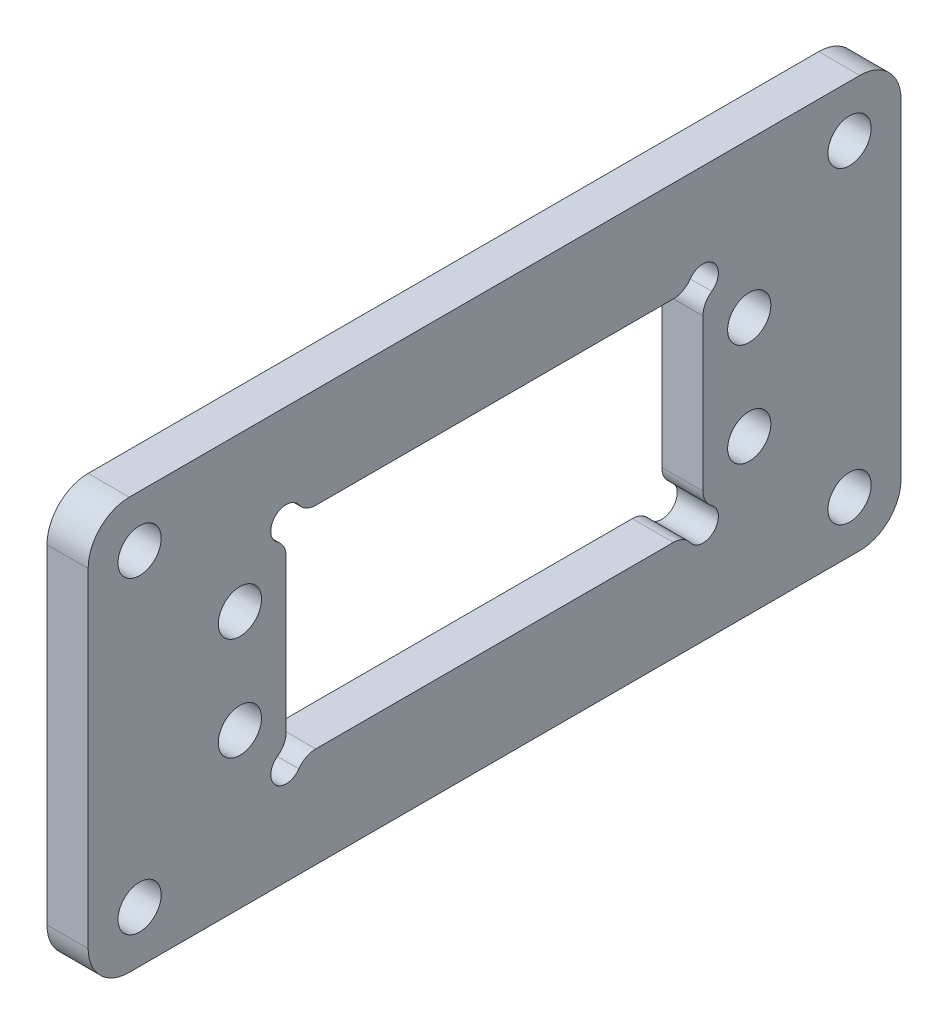
ISO-10303-21;
HEADER;
FILE_DESCRIPTION(('STEP AP214'),'2;1');
FILE_NAME('part.step','',(''),(''),'','','');
FILE_SCHEMA(('AUTOMOTIVE_DESIGN { 1 0 10303 214 1 1 1 1 }'));
ENDSEC;
DATA;
#1=APPLICATION_CONTEXT('core data for automotive mechanical design processes');
#2=APPLICATION_PROTOCOL_DEFINITION('international standard','automotive_design',2000,#1);
#3=PRODUCT_CONTEXT('',#1,'mechanical');
#4=PRODUCT('Part','Part','',(#3));
#5=PRODUCT_RELATED_PRODUCT_CATEGORY('part','',(#4));
#6=PRODUCT_DEFINITION_FORMATION('','',#4);
#7=PRODUCT_DEFINITION_CONTEXT('part definition',#1,'design');
#8=PRODUCT_DEFINITION('design','',#6,#7);
#9=PRODUCT_DEFINITION_SHAPE('','',#8);
#10=(LENGTH_UNIT() NAMED_UNIT(*) SI_UNIT(.MILLI.,.METRE.));
#11=(NAMED_UNIT(*) PLANE_ANGLE_UNIT() SI_UNIT($,.RADIAN.));
#12=(NAMED_UNIT(*) SI_UNIT($,.STERADIAN.) SOLID_ANGLE_UNIT());
#13=UNCERTAINTY_MEASURE_WITH_UNIT(LENGTH_MEASURE(1.E-05),#10,'distance_accuracy_value','');
#14=(GEOMETRIC_REPRESENTATION_CONTEXT(3) GLOBAL_UNCERTAINTY_ASSIGNED_CONTEXT((#13)) GLOBAL_UNIT_ASSIGNED_CONTEXT((#10,
#11,#12)) REPRESENTATION_CONTEXT('',''));
#15=CARTESIAN_POINT('',(0.,0.,0.));
#16=DIRECTION('',(0.,0.,1.));
#17=DIRECTION('',(1.,0.,0.));
#18=AXIS2_PLACEMENT_3D('',#15,#16,#17);
#19=CARTESIAN_POINT('',(4.,0.,0.));
#20=DIRECTION('',(-1.,0.,0.));
#21=DIRECTION('',(0.,0.,1.));
#22=AXIS2_PLACEMENT_3D('',#19,#20,#21);
#23=PLANE('',#22);
#24=DIRECTION('',(0.,0.,-1.));
#25=VECTOR('',#24,1.);
#26=CARTESIAN_POINT('',(4.,-20.,39.5));
#27=LINE('',#26,#25);
#28=CARTESIAN_POINT('',(4.,-20.,35.5));
#29=VERTEX_POINT('',#28);
#30=CARTESIAN_POINT('',(4.,-20.,-35.5));
#31=VERTEX_POINT('',#30);
#32=EDGE_CURVE('E246',#29,#31,#27,.T.);
#33=ORIENTED_EDGE('',*,*,#32,.T.);
#34=CARTESIAN_POINT('',(4.,-16.,-35.5));
#35=DIRECTION('',(-1.,0.,0.));
#36=DIRECTION('',(0.,0.,1.));
#37=AXIS2_PLACEMENT_3D('',#34,#35,#36);
#38=CIRCLE('',#37,4.);
#39=CARTESIAN_POINT('',(4.,-16.,-39.5));
#40=VERTEX_POINT('',#39);
#41=EDGE_CURVE('E266',#31,#40,#38,.F.);
#42=ORIENTED_EDGE('',*,*,#41,.T.);
#43=DIRECTION('',(0.,1.,0.));
#44=VECTOR('',#43,1.);
#45=CARTESIAN_POINT('',(4.,-20.,-39.5));
#46=LINE('',#45,#44);
#47=CARTESIAN_POINT('',(4.,16.,-39.5));
#48=VERTEX_POINT('',#47);
#49=EDGE_CURVE('E228',#40,#48,#46,.T.);
#50=ORIENTED_EDGE('',*,*,#49,.T.);
#51=CARTESIAN_POINT('',(4.,16.,-35.5));
#52=DIRECTION('',(-1.,0.,0.));
#53=DIRECTION('',(0.,0.,1.));
#54=AXIS2_PLACEMENT_3D('',#51,#52,#53);
#55=CIRCLE('',#54,4.);
#56=CARTESIAN_POINT('',(4.,20.,-35.5));
#57=VERTEX_POINT('',#56);
#58=EDGE_CURVE('E262',#48,#57,#55,.F.);
#59=ORIENTED_EDGE('',*,*,#58,.T.);
#60=DIRECTION('',(0.,0.,1.));
#61=VECTOR('',#60,1.);
#62=CARTESIAN_POINT('',(4.,20.,39.5));
#63=LINE('',#62,#61);
#64=CARTESIAN_POINT('',(4.,20.,35.5));
#65=VERTEX_POINT('',#64);
#66=EDGE_CURVE('E453',#57,#65,#63,.T.);
#67=ORIENTED_EDGE('',*,*,#66,.T.);
#68=CARTESIAN_POINT('',(4.,16.,35.5));
#69=DIRECTION('',(-1.,0.,0.));
#70=DIRECTION('',(0.,0.,1.));
#71=AXIS2_PLACEMENT_3D('',#68,#69,#70);
#72=CIRCLE('',#71,4.);
#73=CARTESIAN_POINT('',(4.,16.,39.5));
#74=VERTEX_POINT('',#73);
#75=EDGE_CURVE('E260',#65,#74,#72,.F.);
#76=ORIENTED_EDGE('',*,*,#75,.T.);
#77=DIRECTION('',(0.,-1.,0.));
#78=VECTOR('',#77,1.);
#79=CARTESIAN_POINT('',(4.,-20.,39.5));
#80=LINE('',#79,#78);
#81=CARTESIAN_POINT('',(4.,-16.,39.5));
#82=VERTEX_POINT('',#81);
#83=EDGE_CURVE('E455',#74,#82,#80,.T.);
#84=ORIENTED_EDGE('',*,*,#83,.T.);
#85=CARTESIAN_POINT('',(4.,-16.,35.5));
#86=DIRECTION('',(-1.,0.,0.));
#87=DIRECTION('',(0.,0.,1.));
#88=AXIS2_PLACEMENT_3D('',#85,#86,#87);
#89=CIRCLE('',#88,4.);
#90=EDGE_CURVE('E264',#82,#29,#89,.F.);
#91=ORIENTED_EDGE('',*,*,#90,.T.);
#92=EDGE_LOOP('',(#33,#42,#50,#59,#67,#76,#84,#91));
#93=FACE_BOUND('',#92,.T.);
#94=CARTESIAN_POINT('',(4.,10.25,-20.25));
#95=DIRECTION('',(1.,0.,0.));
#96=DIRECTION('',(0.,0.,-1.));
#97=AXIS2_PLACEMENT_3D('',#94,#95,#96);
#98=CIRCLE('',#97,1.5);
#99=CARTESIAN_POINT('',(4.,9.01902229002756,-21.1071428571428));
#100=VERTEX_POINT('',#99);
#101=CARTESIAN_POINT('',(4.,11.1071428571429,-19.0190222900275));
#102=VERTEX_POINT('',#101);
#103=EDGE_CURVE('E381',#100,#102,#98,.T.);
#104=ORIENTED_EDGE('',*,*,#103,.F.);
#105=CARTESIAN_POINT('',(4.,7.37771867673098,-22.25));
#106=DIRECTION('',(-1.,0.,0.));
#107=DIRECTION('',(0.,0.,1.));
#108=AXIS2_PLACEMENT_3D('',#105,#106,#107);
#109=CIRCLE('',#108,2.);
#110=CARTESIAN_POINT('',(4.,7.37771867673098,-20.25));
#111=VERTEX_POINT('',#110);
#112=EDGE_CURVE('E298',#100,#111,#109,.F.);
#113=ORIENTED_EDGE('',*,*,#112,.T.);
#114=DIRECTION('',(0.,1.,0.));
#115=VECTOR('',#114,1.);
#116=CARTESIAN_POINT('',(4.,-10.25,-20.25));
#117=LINE('',#116,#115);
#118=CARTESIAN_POINT('',(4.,-7.36674537458786,-20.25));
#119=VERTEX_POINT('',#118);
#120=EDGE_CURVE('E243',#119,#111,#117,.T.);
#121=ORIENTED_EDGE('',*,*,#120,.F.);
#122=CARTESIAN_POINT('',(4.,-7.36674537458786,-22.25));
#123=DIRECTION('',(-1.,0.,0.));
#124=DIRECTION('',(0.,0.,1.));
#125=AXIS2_PLACEMENT_3D('',#122,#123,#124);
#126=CIRCLE('',#125,2.);
#127=CARTESIAN_POINT('',(4.,-9.00804898788443,-21.1071428571428));
#128=VERTEX_POINT('',#127);
#129=EDGE_CURVE('E296',#119,#128,#126,.F.);
#130=ORIENTED_EDGE('',*,*,#129,.T.);
#131=CARTESIAN_POINT('',(4.,-10.2390266978569,-20.25));
#132=DIRECTION('',(1.,0.,0.));
#133=DIRECTION('',(0.,0.,-1.));
#134=AXIS2_PLACEMENT_3D('',#131,#132,#133);
#135=CIRCLE('',#134,1.5);
#136=CARTESIAN_POINT('',(4.,-11.1008723987754,-19.022310304756));
#137=VERTEX_POINT('',#136);
#138=EDGE_CURVE('E378',#137,#128,#135,.T.);
#139=ORIENTED_EDGE('',*,*,#138,.F.);
#140=CARTESIAN_POINT('',(4.,-12.25,-17.3853907110973));
#141=DIRECTION('',(-1.,0.,0.));
#142=DIRECTION('',(0.,0.,1.));
#143=AXIS2_PLACEMENT_3D('',#140,#141,#142);
#144=CIRCLE('',#143,2.);
#145=CARTESIAN_POINT('',(4.,-10.25,-17.3853907110973));
#146=VERTEX_POINT('',#145);
#147=EDGE_CURVE('E294',#137,#146,#144,.F.);
#148=ORIENTED_EDGE('',*,*,#147,.T.);
#149=DIRECTION('',(0.,0.,-1.));
#150=VECTOR('',#149,1.);
#151=CARTESIAN_POINT('',(4.,-10.25,-20.25));
#152=LINE('',#151,#150);
#153=CARTESIAN_POINT('',(4.,-10.25,17.377718676731));
#154=VERTEX_POINT('',#153);
#155=EDGE_CURVE('E442',#154,#146,#152,.T.);
#156=ORIENTED_EDGE('',*,*,#155,.F.);
#157=CARTESIAN_POINT('',(4.,-12.25,17.377718676731));
#158=DIRECTION('',(-1.,0.,0.));
#159=DIRECTION('',(0.,0.,1.));
#160=AXIS2_PLACEMENT_3D('',#157,#158,#159);
#161=CIRCLE('',#160,2.);
#162=CARTESIAN_POINT('',(4.,-11.1071428571429,19.0190222900276));
#163=VERTEX_POINT('',#162);
#164=EDGE_CURVE('E292',#154,#163,#161,.F.);
#165=ORIENTED_EDGE('',*,*,#164,.T.);
#166=CARTESIAN_POINT('',(4.,-10.25,20.25));
#167=DIRECTION('',(1.,0.,0.));
#168=DIRECTION('',(0.,0.,-1.));
#169=AXIS2_PLACEMENT_3D('',#166,#167,#168);
#170=CIRCLE('',#169,1.5);
#171=CARTESIAN_POINT('',(4.,-9.01902229002758,21.1071428571429));
#172=VERTEX_POINT('',#171);
#173=EDGE_CURVE('E373',#172,#163,#170,.T.);
#174=ORIENTED_EDGE('',*,*,#173,.F.);
#175=CARTESIAN_POINT('',(4.,-7.377718676731,22.25));
#176=DIRECTION('',(-1.,0.,0.));
#177=DIRECTION('',(0.,0.,1.));
#178=AXIS2_PLACEMENT_3D('',#175,#176,#177);
#179=CIRCLE('',#178,2.);
#180=CARTESIAN_POINT('',(4.,-7.377718676731,20.25));
#181=VERTEX_POINT('',#180);
#182=EDGE_CURVE('E290',#172,#181,#179,.F.);
#183=ORIENTED_EDGE('',*,*,#182,.T.);
#184=DIRECTION('',(0.,-1.,0.));
#185=VECTOR('',#184,1.);
#186=CARTESIAN_POINT('',(4.,-10.25,20.25));
#187=LINE('',#186,#185);
#188=CARTESIAN_POINT('',(4.,7.37771867673098,20.25));
#189=VERTEX_POINT('',#188);
#190=EDGE_CURVE('E357',#189,#181,#187,.T.);
#191=ORIENTED_EDGE('',*,*,#190,.F.);
#192=CARTESIAN_POINT('',(4.,7.37771867673098,22.25));
#193=DIRECTION('',(-1.,0.,0.));
#194=DIRECTION('',(0.,0.,1.));
#195=AXIS2_PLACEMENT_3D('',#192,#193,#194);
#196=CIRCLE('',#195,2.);
#197=CARTESIAN_POINT('',(4.,9.01902229002756,21.1071428571429));
#198=VERTEX_POINT('',#197);
#199=EDGE_CURVE('E288',#189,#198,#196,.F.);
#200=ORIENTED_EDGE('',*,*,#199,.T.);
#201=CARTESIAN_POINT('',(4.,10.25,20.25));
#202=DIRECTION('',(1.,0.,0.));
#203=DIRECTION('',(0.,0.,-1.));
#204=AXIS2_PLACEMENT_3D('',#201,#202,#203);
#205=CIRCLE('',#204,1.5);
#206=CARTESIAN_POINT('',(4.,11.1071428571428,19.0190222900276));
#207=VERTEX_POINT('',#206);
#208=EDGE_CURVE('E365',#207,#198,#205,.T.);
#209=ORIENTED_EDGE('',*,*,#208,.F.);
#210=CARTESIAN_POINT('',(4.,12.25,17.377718676731));
#211=DIRECTION('',(-1.,0.,0.));
#212=DIRECTION('',(0.,0.,1.));
#213=AXIS2_PLACEMENT_3D('',#210,#211,#212);
#214=CIRCLE('',#213,2.);
#215=CARTESIAN_POINT('',(4.,10.25,17.377718676731));
#216=VERTEX_POINT('',#215);
#217=EDGE_CURVE('E284',#207,#216,#214,.F.);
#218=ORIENTED_EDGE('',*,*,#217,.T.);
#219=DIRECTION('',(0.,0.,1.));
#220=VECTOR('',#219,1.);
#221=CARTESIAN_POINT('',(4.,10.25,-20.25));
#222=LINE('',#221,#220);
#223=CARTESIAN_POINT('',(4.,10.25,-17.377718676731));
#224=VERTEX_POINT('',#223);
#225=EDGE_CURVE('E237',#224,#216,#222,.T.);
#226=ORIENTED_EDGE('',*,*,#225,.F.);
#227=CARTESIAN_POINT('',(4.,12.25,-17.377718676731));
#228=DIRECTION('',(-1.,0.,0.));
#229=DIRECTION('',(0.,0.,1.));
#230=AXIS2_PLACEMENT_3D('',#227,#228,#229);
#231=CIRCLE('',#230,2.);
#232=EDGE_CURVE('E286',#224,#102,#231,.F.);
#233=ORIENTED_EDGE('',*,*,#232,.T.);
#234=EDGE_LOOP('',(#104,#113,#121,#130,#139,#148,#156,#165,#174,#183,#191,#200,#209,#218,#226,#233));
#235=FACE_BOUND('',#234,.T.);
#236=CARTESIAN_POINT('',(4.,15.,34.5));
#237=DIRECTION('',(1.,0.,0.));
#238=DIRECTION('',(0.,0.,-1.));
#239=AXIS2_PLACEMENT_3D('',#236,#237,#238);
#240=CIRCLE('',#239,2.1);
#241=CARTESIAN_POINT('',(4.,15.,32.4));
#242=VERTEX_POINT('',#241);
#243=EDGE_CURVE('E434',#242,#242,#240,.T.);
#244=ORIENTED_EDGE('',*,*,#243,.F.);
#245=EDGE_LOOP('',(#244));
#246=FACE_BOUND('',#245,.T.);
#247=CARTESIAN_POINT('',(4.,-15.,34.5));
#248=DIRECTION('',(1.,0.,0.));
#249=DIRECTION('',(0.,0.,-1.));
#250=AXIS2_PLACEMENT_3D('',#247,#248,#249);
#251=CIRCLE('',#250,2.1);
#252=CARTESIAN_POINT('',(4.,-15.,32.4));
#253=VERTEX_POINT('',#252);
#254=EDGE_CURVE('E428',#253,#253,#251,.T.);
#255=ORIENTED_EDGE('',*,*,#254,.F.);
#256=EDGE_LOOP('',(#255));
#257=FACE_BOUND('',#256,.T.);
#258=CARTESIAN_POINT('',(4.,-5.00000000000001,24.75));
#259=DIRECTION('',(1.,0.,0.));
#260=DIRECTION('',(0.,0.,-1.));
#261=AXIS2_PLACEMENT_3D('',#258,#259,#260);
#262=CIRCLE('',#261,2.1);
#263=CARTESIAN_POINT('',(4.,-5.00000000000001,22.65));
#264=VERTEX_POINT('',#263);
#265=EDGE_CURVE('E422',#264,#264,#262,.T.);
#266=ORIENTED_EDGE('',*,*,#265,.F.);
#267=EDGE_LOOP('',(#266));
#268=FACE_BOUND('',#267,.T.);
#269=CARTESIAN_POINT('',(4.,4.99999999999999,24.75));
#270=DIRECTION('',(1.,0.,0.));
#271=DIRECTION('',(0.,0.,-1.));
#272=AXIS2_PLACEMENT_3D('',#269,#270,#271);
#273=CIRCLE('',#272,2.1);
#274=CARTESIAN_POINT('',(4.,4.99999999999999,22.65));
#275=VERTEX_POINT('',#274);
#276=EDGE_CURVE('E416',#275,#275,#273,.T.);
#277=ORIENTED_EDGE('',*,*,#276,.F.);
#278=EDGE_LOOP('',(#277));
#279=FACE_BOUND('',#278,.T.);
#280=CARTESIAN_POINT('',(4.,4.99999999999999,-24.75));
#281=DIRECTION('',(1.,0.,0.));
#282=DIRECTION('',(0.,0.,-1.));
#283=AXIS2_PLACEMENT_3D('',#280,#281,#282);
#284=CIRCLE('',#283,2.1);
#285=CARTESIAN_POINT('',(4.,4.99999999999999,-26.85));
#286=VERTEX_POINT('',#285);
#287=EDGE_CURVE('E410',#286,#286,#284,.T.);
#288=ORIENTED_EDGE('',*,*,#287,.F.);
#289=EDGE_LOOP('',(#288));
#290=FACE_BOUND('',#289,.T.);
#291=CARTESIAN_POINT('',(4.,-5.00000000000001,-24.75));
#292=DIRECTION('',(1.,0.,0.));
#293=DIRECTION('',(0.,0.,-1.));
#294=AXIS2_PLACEMENT_3D('',#291,#292,#293);
#295=CIRCLE('',#294,2.1);
#296=CARTESIAN_POINT('',(4.,-5.00000000000001,-26.85));
#297=VERTEX_POINT('',#296);
#298=EDGE_CURVE('E404',#297,#297,#295,.T.);
#299=ORIENTED_EDGE('',*,*,#298,.F.);
#300=EDGE_LOOP('',(#299));
#301=FACE_BOUND('',#300,.T.);
#302=CARTESIAN_POINT('',(4.,15.,-34.5));
#303=DIRECTION('',(1.,0.,0.));
#304=DIRECTION('',(0.,0.,-1.));
#305=AXIS2_PLACEMENT_3D('',#302,#303,#304);
#306=CIRCLE('',#305,2.1);
#307=CARTESIAN_POINT('',(4.,15.,-36.6));
#308=VERTEX_POINT('',#307);
#309=EDGE_CURVE('E398',#308,#308,#306,.T.);
#310=ORIENTED_EDGE('',*,*,#309,.F.);
#311=EDGE_LOOP('',(#310));
#312=FACE_BOUND('',#311,.T.);
#313=CARTESIAN_POINT('',(4.,-15.,-34.5));
#314=DIRECTION('',(1.,0.,0.));
#315=DIRECTION('',(0.,0.,-1.));
#316=AXIS2_PLACEMENT_3D('',#313,#314,#315);
#317=CIRCLE('',#316,2.1);
#318=CARTESIAN_POINT('',(4.,-15.,-36.6));
#319=VERTEX_POINT('',#318);
#320=EDGE_CURVE('E392',#319,#319,#317,.T.);
#321=ORIENTED_EDGE('',*,*,#320,.F.);
#322=EDGE_LOOP('',(#321));
#323=FACE_BOUND('',#322,.T.);
#324=ADVANCED_FACE('F45',(#93,#235,#246,#257,#268,#279,#290,#301,#312,#323),#23,.F.);
#325=CARTESIAN_POINT('',(0.,0.,0.));
#326=DIRECTION('',(-1.,0.,0.));
#327=DIRECTION('',(0.,0.,1.));
#328=AXIS2_PLACEMENT_3D('',#325,#326,#327);
#329=PLANE('',#328);
#330=DIRECTION('',(0.,1.,0.));
#331=VECTOR('',#330,1.);
#332=CARTESIAN_POINT('',(0.,-10.25,-20.25));
#333=LINE('',#332,#331);
#334=CARTESIAN_POINT('',(0.,-7.36674537458786,-20.25));
#335=VERTEX_POINT('',#334);
#336=CARTESIAN_POINT('',(0.,7.37771867673098,-20.25));
#337=VERTEX_POINT('',#336);
#338=EDGE_CURVE('E358',#335,#337,#333,.T.);
#339=ORIENTED_EDGE('',*,*,#338,.T.);
#340=CARTESIAN_POINT('',(0.,7.37771867673098,-22.25));
#341=DIRECTION('',(-1.,0.,0.));
#342=DIRECTION('',(0.,0.,1.));
#343=AXIS2_PLACEMENT_3D('',#340,#341,#342);
#344=CIRCLE('',#343,2.);
#345=CARTESIAN_POINT('',(0.,9.01902229002756,-21.1071428571428));
#346=VERTEX_POINT('',#345);
#347=EDGE_CURVE('E316',#337,#346,#344,.T.);
#348=ORIENTED_EDGE('',*,*,#347,.T.);
#349=CARTESIAN_POINT('',(0.,10.25,-20.25));
#350=DIRECTION('',(-1.,0.,0.));
#351=DIRECTION('',(0.,0.,1.));
#352=AXIS2_PLACEMENT_3D('',#349,#350,#351);
#353=CIRCLE('',#352,1.5);
#354=CARTESIAN_POINT('',(0.,11.1071428571429,-19.0190222900275));
#355=VERTEX_POINT('',#354);
#356=EDGE_CURVE('E375',#355,#346,#353,.T.);
#357=ORIENTED_EDGE('',*,*,#356,.F.);
#358=CARTESIAN_POINT('',(0.,12.25,-17.377718676731));
#359=DIRECTION('',(-1.,0.,0.));
#360=DIRECTION('',(0.,0.,1.));
#361=AXIS2_PLACEMENT_3D('',#358,#359,#360);
#362=CIRCLE('',#361,2.);
#363=CARTESIAN_POINT('',(0.,10.25,-17.377718676731));
#364=VERTEX_POINT('',#363);
#365=EDGE_CURVE('E306',#355,#364,#362,.T.);
#366=ORIENTED_EDGE('',*,*,#365,.T.);
#367=DIRECTION('',(0.,0.,1.));
#368=VECTOR('',#367,1.);
#369=CARTESIAN_POINT('',(0.,10.25,-20.25));
#370=LINE('',#369,#368);
#371=CARTESIAN_POINT('',(0.,10.25,17.377718676731));
#372=VERTEX_POINT('',#371);
#373=EDGE_CURVE('E347',#364,#372,#370,.T.);
#374=ORIENTED_EDGE('',*,*,#373,.T.);
#375=CARTESIAN_POINT('',(0.,12.25,17.377718676731));
#376=DIRECTION('',(-1.,0.,0.));
#377=DIRECTION('',(0.,0.,1.));
#378=AXIS2_PLACEMENT_3D('',#375,#376,#377);
#379=CIRCLE('',#378,2.);
#380=CARTESIAN_POINT('',(0.,11.1071428571428,19.0190222900276));
#381=VERTEX_POINT('',#380);
#382=EDGE_CURVE('E304',#372,#381,#379,.T.);
#383=ORIENTED_EDGE('',*,*,#382,.T.);
#384=CARTESIAN_POINT('',(0.,10.25,20.25));
#385=DIRECTION('',(-1.,0.,0.));
#386=DIRECTION('',(0.,0.,1.));
#387=AXIS2_PLACEMENT_3D('',#384,#385,#386);
#388=CIRCLE('',#387,1.5);
#389=CARTESIAN_POINT('',(0.,9.01902229002756,21.1071428571429));
#390=VERTEX_POINT('',#389);
#391=EDGE_CURVE('E367',#390,#381,#388,.T.);
#392=ORIENTED_EDGE('',*,*,#391,.F.);
#393=CARTESIAN_POINT('',(0.,7.37771867673098,22.25));
#394=DIRECTION('',(-1.,0.,0.));
#395=DIRECTION('',(0.,0.,1.));
#396=AXIS2_PLACEMENT_3D('',#393,#394,#395);
#397=CIRCLE('',#396,2.);
#398=CARTESIAN_POINT('',(0.,7.37771867673098,20.25));
#399=VERTEX_POINT('',#398);
#400=EDGE_CURVE('E308',#390,#399,#397,.T.);
#401=ORIENTED_EDGE('',*,*,#400,.T.);
#402=DIRECTION('',(0.,-1.,0.));
#403=VECTOR('',#402,1.);
#404=CARTESIAN_POINT('',(0.,-10.25,20.25));
#405=LINE('',#404,#403);
#406=CARTESIAN_POINT('',(0.,-7.377718676731,20.25));
#407=VERTEX_POINT('',#406);
#408=EDGE_CURVE('E437',#399,#407,#405,.T.);
#409=ORIENTED_EDGE('',*,*,#408,.T.);
#410=CARTESIAN_POINT('',(0.,-7.377718676731,22.25));
#411=DIRECTION('',(-1.,0.,0.));
#412=DIRECTION('',(0.,0.,1.));
#413=AXIS2_PLACEMENT_3D('',#410,#411,#412);
#414=CIRCLE('',#413,2.);
#415=CARTESIAN_POINT('',(0.,-9.01902229002758,21.1071428571429));
#416=VERTEX_POINT('',#415);
#417=EDGE_CURVE('E310',#407,#416,#414,.T.);
#418=ORIENTED_EDGE('',*,*,#417,.T.);
#419=CARTESIAN_POINT('',(0.,-10.25,20.25));
#420=DIRECTION('',(-1.,0.,0.));
#421=DIRECTION('',(0.,0.,1.));
#422=AXIS2_PLACEMENT_3D('',#419,#420,#421);
#423=CIRCLE('',#422,1.5);
#424=CARTESIAN_POINT('',(0.,-11.1071428571429,19.0190222900276));
#425=VERTEX_POINT('',#424);
#426=EDGE_CURVE('E388',#425,#416,#423,.T.);
#427=ORIENTED_EDGE('',*,*,#426,.F.);
#428=CARTESIAN_POINT('',(0.,-12.25,17.377718676731));
#429=DIRECTION('',(-1.,0.,0.));
#430=DIRECTION('',(0.,0.,1.));
#431=AXIS2_PLACEMENT_3D('',#428,#429,#430);
#432=CIRCLE('',#431,2.);
#433=CARTESIAN_POINT('',(0.,-10.25,17.377718676731));
#434=VERTEX_POINT('',#433);
#435=EDGE_CURVE('E312',#425,#434,#432,.T.);
#436=ORIENTED_EDGE('',*,*,#435,.T.);
#437=DIRECTION('',(0.,0.,-1.));
#438=VECTOR('',#437,1.);
#439=CARTESIAN_POINT('',(0.,-10.25,-20.25));
#440=LINE('',#439,#438);
#441=CARTESIAN_POINT('',(0.,-10.25,-17.3853907110973));
#442=VERTEX_POINT('',#441);
#443=EDGE_CURVE('E449',#434,#442,#440,.T.);
#444=ORIENTED_EDGE('',*,*,#443,.T.);
#445=CARTESIAN_POINT('',(0.,-12.25,-17.3853907110973));
#446=DIRECTION('',(-1.,0.,0.));
#447=DIRECTION('',(0.,0.,1.));
#448=AXIS2_PLACEMENT_3D('',#445,#446,#447);
#449=CIRCLE('',#448,2.);
#450=CARTESIAN_POINT('',(0.,-11.1008723987754,-19.022310304756));
#451=VERTEX_POINT('',#450);
#452=EDGE_CURVE('E60',#442,#451,#449,.T.);
#453=ORIENTED_EDGE('',*,*,#452,.T.);
#454=CARTESIAN_POINT('',(0.,-10.2390266978569,-20.25));
#455=DIRECTION('',(-1.,0.,0.));
#456=DIRECTION('',(0.,0.,1.));
#457=AXIS2_PLACEMENT_3D('',#454,#455,#456);
#458=CIRCLE('',#457,1.5);
#459=CARTESIAN_POINT('',(0.,-9.00804898788443,-21.1071428571428));
#460=VERTEX_POINT('',#459);
#461=EDGE_CURVE('E386',#460,#451,#458,.T.);
#462=ORIENTED_EDGE('',*,*,#461,.F.);
#463=CARTESIAN_POINT('',(0.,-7.36674537458786,-22.25));
#464=DIRECTION('',(-1.,0.,0.));
#465=DIRECTION('',(0.,0.,1.));
#466=AXIS2_PLACEMENT_3D('',#463,#464,#465);
#467=CIRCLE('',#466,2.);
#468=EDGE_CURVE('E68',#460,#335,#467,.T.);
#469=ORIENTED_EDGE('',*,*,#468,.T.);
#470=EDGE_LOOP('',(#339,#348,#357,#366,#374,#383,#392,#401,#409,#418,#427,#436,#444,#453,#462,#469));
#471=FACE_BOUND('',#470,.T.);
#472=CARTESIAN_POINT('',(0.,15.,-34.5));
#473=DIRECTION('',(1.,0.,0.));
#474=DIRECTION('',(0.,0.,-1.));
#475=AXIS2_PLACEMENT_3D('',#472,#473,#474);
#476=CIRCLE('',#475,2.1);
#477=CARTESIAN_POINT('',(0.,15.,-36.6));
#478=VERTEX_POINT('',#477);
#479=EDGE_CURVE('E395',#478,#478,#476,.T.);
#480=ORIENTED_EDGE('',*,*,#479,.T.);
#481=EDGE_LOOP('',(#480));
#482=FACE_BOUND('',#481,.T.);
#483=CARTESIAN_POINT('',(0.,4.99999999999999,-24.75));
#484=DIRECTION('',(1.,0.,0.));
#485=DIRECTION('',(0.,0.,-1.));
#486=AXIS2_PLACEMENT_3D('',#483,#484,#485);
#487=CIRCLE('',#486,2.1);
#488=CARTESIAN_POINT('',(0.,4.99999999999999,-26.85));
#489=VERTEX_POINT('',#488);
#490=EDGE_CURVE('E407',#489,#489,#487,.T.);
#491=ORIENTED_EDGE('',*,*,#490,.T.);
#492=EDGE_LOOP('',(#491));
#493=FACE_BOUND('',#492,.T.);
#494=CARTESIAN_POINT('',(0.,-5.00000000000001,24.75));
#495=DIRECTION('',(1.,0.,0.));
#496=DIRECTION('',(0.,0.,-1.));
#497=AXIS2_PLACEMENT_3D('',#494,#495,#496);
#498=CIRCLE('',#497,2.1);
#499=CARTESIAN_POINT('',(0.,-5.00000000000001,22.65));
#500=VERTEX_POINT('',#499);
#501=EDGE_CURVE('E419',#500,#500,#498,.T.);
#502=ORIENTED_EDGE('',*,*,#501,.T.);
#503=EDGE_LOOP('',(#502));
#504=FACE_BOUND('',#503,.T.);
#505=CARTESIAN_POINT('',(0.,15.,34.5));
#506=DIRECTION('',(1.,0.,0.));
#507=DIRECTION('',(0.,0.,-1.));
#508=AXIS2_PLACEMENT_3D('',#505,#506,#507);
#509=CIRCLE('',#508,2.1);
#510=CARTESIAN_POINT('',(0.,15.,32.4));
#511=VERTEX_POINT('',#510);
#512=EDGE_CURVE('E431',#511,#511,#509,.T.);
#513=ORIENTED_EDGE('',*,*,#512,.T.);
#514=EDGE_LOOP('',(#513));
#515=FACE_BOUND('',#514,.T.);
#516=DIRECTION('',(0.,1.,0.));
#517=VECTOR('',#516,1.);
#518=CARTESIAN_POINT('',(0.,-20.,-39.5));
#519=LINE('',#518,#517);
#520=CARTESIAN_POINT('',(0.,-16.,-39.5));
#521=VERTEX_POINT('',#520);
#522=CARTESIAN_POINT('',(0.,16.,-39.5));
#523=VERTEX_POINT('',#522);
#524=EDGE_CURVE('E225',#521,#523,#519,.T.);
#525=ORIENTED_EDGE('',*,*,#524,.F.);
#526=CARTESIAN_POINT('',(0.,-16.,-35.5));
#527=DIRECTION('',(-1.,0.,0.));
#528=DIRECTION('',(0.,0.,1.));
#529=AXIS2_PLACEMENT_3D('',#526,#527,#528);
#530=CIRCLE('',#529,4.);
#531=CARTESIAN_POINT('',(0.,-20.,-35.5));
#532=VERTEX_POINT('',#531);
#533=EDGE_CURVE('E208',#521,#532,#530,.T.);
#534=ORIENTED_EDGE('',*,*,#533,.T.);
#535=DIRECTION('',(0.,0.,-1.));
#536=VECTOR('',#535,1.);
#537=CARTESIAN_POINT('',(0.,-20.,39.5));
#538=LINE('',#537,#536);
#539=CARTESIAN_POINT('',(0.,-20.,35.5));
#540=VERTEX_POINT('',#539);
#541=EDGE_CURVE('E251',#540,#532,#538,.T.);
#542=ORIENTED_EDGE('',*,*,#541,.F.);
#543=CARTESIAN_POINT('',(0.,-16.,35.5));
#544=DIRECTION('',(-1.,0.,0.));
#545=DIRECTION('',(0.,0.,1.));
#546=AXIS2_PLACEMENT_3D('',#543,#544,#545);
#547=CIRCLE('',#546,4.);
#548=CARTESIAN_POINT('',(0.,-16.,39.5));
#549=VERTEX_POINT('',#548);
#550=EDGE_CURVE('E219',#540,#549,#547,.T.);
#551=ORIENTED_EDGE('',*,*,#550,.T.);
#552=DIRECTION('',(0.,-1.,0.));
#553=VECTOR('',#552,1.);
#554=CARTESIAN_POINT('',(0.,-20.,39.5));
#555=LINE('',#554,#553);
#556=CARTESIAN_POINT('',(0.,16.,39.5));
#557=VERTEX_POINT('',#556);
#558=EDGE_CURVE('E240',#557,#549,#555,.T.);
#559=ORIENTED_EDGE('',*,*,#558,.F.);
#560=CARTESIAN_POINT('',(0.,16.,35.5));
#561=DIRECTION('',(-1.,0.,0.));
#562=DIRECTION('',(0.,0.,1.));
#563=AXIS2_PLACEMENT_3D('',#560,#561,#562);
#564=CIRCLE('',#563,4.);
#565=CARTESIAN_POINT('',(0.,20.,35.5));
#566=VERTEX_POINT('',#565);
#567=EDGE_CURVE('E229',#557,#566,#564,.T.);
#568=ORIENTED_EDGE('',*,*,#567,.T.);
#569=DIRECTION('',(0.,0.,1.));
#570=VECTOR('',#569,1.);
#571=CARTESIAN_POINT('',(0.,20.,39.5));
#572=LINE('',#571,#570);
#573=CARTESIAN_POINT('',(0.,20.,-35.5));
#574=VERTEX_POINT('',#573);
#575=EDGE_CURVE('E236',#574,#566,#572,.T.);
#576=ORIENTED_EDGE('',*,*,#575,.F.);
#577=CARTESIAN_POINT('',(0.,16.,-35.5));
#578=DIRECTION('',(-1.,0.,0.));
#579=DIRECTION('',(0.,0.,1.));
#580=AXIS2_PLACEMENT_3D('',#577,#578,#579);
#581=CIRCLE('',#580,4.);
#582=EDGE_CURVE('E235',#574,#523,#581,.T.);
#583=ORIENTED_EDGE('',*,*,#582,.T.);
#584=EDGE_LOOP('',(#525,#534,#542,#551,#559,#568,#576,#583));
#585=FACE_BOUND('',#584,.T.);
#586=CARTESIAN_POINT('',(0.,-15.,34.5));
#587=DIRECTION('',(1.,0.,0.));
#588=DIRECTION('',(0.,0.,-1.));
#589=AXIS2_PLACEMENT_3D('',#586,#587,#588);
#590=CIRCLE('',#589,2.1);
#591=CARTESIAN_POINT('',(0.,-15.,32.4));
#592=VERTEX_POINT('',#591);
#593=EDGE_CURVE('E425',#592,#592,#590,.T.);
#594=ORIENTED_EDGE('',*,*,#593,.T.);
#595=EDGE_LOOP('',(#594));
#596=FACE_BOUND('',#595,.T.);
#597=CARTESIAN_POINT('',(0.,4.99999999999999,24.75));
#598=DIRECTION('',(1.,0.,0.));
#599=DIRECTION('',(0.,0.,-1.));
#600=AXIS2_PLACEMENT_3D('',#597,#598,#599);
#601=CIRCLE('',#600,2.1);
#602=CARTESIAN_POINT('',(0.,4.99999999999999,22.65));
#603=VERTEX_POINT('',#602);
#604=EDGE_CURVE('E413',#603,#603,#601,.T.);
#605=ORIENTED_EDGE('',*,*,#604,.T.);
#606=EDGE_LOOP('',(#605));
#607=FACE_BOUND('',#606,.T.);
#608=CARTESIAN_POINT('',(0.,-5.00000000000001,-24.75));
#609=DIRECTION('',(1.,0.,0.));
#610=DIRECTION('',(0.,0.,-1.));
#611=AXIS2_PLACEMENT_3D('',#608,#609,#610);
#612=CIRCLE('',#611,2.1);
#613=CARTESIAN_POINT('',(0.,-5.00000000000001,-26.85));
#614=VERTEX_POINT('',#613);
#615=EDGE_CURVE('E401',#614,#614,#612,.T.);
#616=ORIENTED_EDGE('',*,*,#615,.T.);
#617=EDGE_LOOP('',(#616));
#618=FACE_BOUND('',#617,.T.);
#619=CARTESIAN_POINT('',(0.,-15.,-34.5));
#620=DIRECTION('',(1.,0.,0.));
#621=DIRECTION('',(0.,0.,-1.));
#622=AXIS2_PLACEMENT_3D('',#619,#620,#621);
#623=CIRCLE('',#622,2.1);
#624=CARTESIAN_POINT('',(0.,-15.,-36.6));
#625=VERTEX_POINT('',#624);
#626=EDGE_CURVE('E391',#625,#625,#623,.T.);
#627=ORIENTED_EDGE('',*,*,#626,.T.);
#628=EDGE_LOOP('',(#627));
#629=FACE_BOUND('',#628,.T.);
#630=ADVANCED_FACE('F232',(#471,#482,#493,#504,#515,#585,#596,#607,#618,#629),#329,.T.);
#631=CARTESIAN_POINT('',(4.,-20.,-39.5));
#632=DIRECTION('',(0.,0.,1.));
#633=DIRECTION('',(1.,0.,0.));
#634=AXIS2_PLACEMENT_3D('',#631,#632,#633);
#635=PLANE('',#634);
#636=ORIENTED_EDGE('',*,*,#49,.F.);
#637=DIRECTION('',(-1.,0.,0.));
#638=VECTOR('',#637,1.);
#639=CARTESIAN_POINT('',(4.,-16.,-39.5));
#640=LINE('',#639,#638);
#641=EDGE_CURVE('E212',#40,#521,#640,.T.);
#642=ORIENTED_EDGE('',*,*,#641,.T.);
#643=ORIENTED_EDGE('',*,*,#524,.T.);
#644=DIRECTION('',(-1.,0.,0.));
#645=VECTOR('',#644,1.);
#646=CARTESIAN_POINT('',(4.,16.,-39.5));
#647=LINE('',#646,#645);
#648=EDGE_CURVE('E230',#523,#48,#647,.F.);
#649=ORIENTED_EDGE('',*,*,#648,.T.);
#650=EDGE_LOOP('',(#636,#642,#643,#649));
#651=FACE_BOUND('',#650,.T.);
#652=ADVANCED_FACE('F224',(#651),#635,.F.);
#653=CARTESIAN_POINT('',(4.,20.,39.5));
#654=DIRECTION('',(0.,-1.,0.));
#655=DIRECTION('',(0.,0.,-1.));
#656=AXIS2_PLACEMENT_3D('',#653,#654,#655);
#657=PLANE('',#656);
#658=ORIENTED_EDGE('',*,*,#66,.F.);
#659=DIRECTION('',(-1.,0.,0.));
#660=VECTOR('',#659,1.);
#661=CARTESIAN_POINT('',(4.,20.,-35.5));
#662=LINE('',#661,#660);
#663=EDGE_CURVE('E275',#57,#574,#662,.T.);
#664=ORIENTED_EDGE('',*,*,#663,.T.);
#665=ORIENTED_EDGE('',*,*,#575,.T.);
#666=DIRECTION('',(-1.,0.,0.));
#667=VECTOR('',#666,1.);
#668=CARTESIAN_POINT('',(4.,20.,35.5));
#669=LINE('',#668,#667);
#670=EDGE_CURVE('E273',#566,#65,#669,.F.);
#671=ORIENTED_EDGE('',*,*,#670,.T.);
#672=EDGE_LOOP('',(#658,#664,#665,#671));
#673=FACE_BOUND('',#672,.T.);
#674=ADVANCED_FACE('F478',(#673),#657,.F.);
#675=CARTESIAN_POINT('',(4.,-20.,39.5));
#676=DIRECTION('',(0.,0.,-1.));
#677=DIRECTION('',(-1.,0.,0.));
#678=AXIS2_PLACEMENT_3D('',#675,#676,#677);
#679=PLANE('',#678);
#680=ORIENTED_EDGE('',*,*,#558,.T.);
#681=DIRECTION('',(-1.,0.,0.));
#682=VECTOR('',#681,1.);
#683=CARTESIAN_POINT('',(4.,-16.,39.5));
#684=LINE('',#683,#682);
#685=EDGE_CURVE('E271',#549,#82,#684,.F.);
#686=ORIENTED_EDGE('',*,*,#685,.T.);
#687=ORIENTED_EDGE('',*,*,#83,.F.);
#688=DIRECTION('',(-1.,0.,0.));
#689=VECTOR('',#688,1.);
#690=CARTESIAN_POINT('',(4.,16.,39.5));
#691=LINE('',#690,#689);
#692=EDGE_CURVE('E268',#74,#557,#691,.T.);
#693=ORIENTED_EDGE('',*,*,#692,.T.);
#694=EDGE_LOOP('',(#680,#686,#687,#693));
#695=FACE_BOUND('',#694,.T.);
#696=ADVANCED_FACE('F470',(#695),#679,.F.);
#697=CARTESIAN_POINT('',(4.,-20.,39.5));
#698=DIRECTION('',(0.,1.,0.));
#699=DIRECTION('',(0.,0.,1.));
#700=AXIS2_PLACEMENT_3D('',#697,#698,#699);
#701=PLANE('',#700);
#702=ORIENTED_EDGE('',*,*,#541,.T.);
#703=DIRECTION('',(-1.,0.,0.));
#704=VECTOR('',#703,1.);
#705=CARTESIAN_POINT('',(4.,-20.,-35.5));
#706=LINE('',#705,#704);
#707=EDGE_CURVE('E213',#532,#31,#706,.F.);
#708=ORIENTED_EDGE('',*,*,#707,.T.);
#709=ORIENTED_EDGE('',*,*,#32,.F.);
#710=DIRECTION('',(-1.,0.,0.));
#711=VECTOR('',#710,1.);
#712=CARTESIAN_POINT('',(4.,-20.,35.5));
#713=LINE('',#712,#711);
#714=EDGE_CURVE('E218',#29,#540,#713,.T.);
#715=ORIENTED_EDGE('',*,*,#714,.T.);
#716=EDGE_LOOP('',(#702,#708,#709,#715));
#717=FACE_BOUND('',#716,.T.);
#718=ADVANCED_FACE('F464',(#717),#701,.F.);
#719=CARTESIAN_POINT('',(4.,-10.25,20.25));
#720=DIRECTION('',(0.,0.,-1.));
#721=DIRECTION('',(-1.,0.,0.));
#722=AXIS2_PLACEMENT_3D('',#719,#720,#721);
#723=PLANE('',#722);
#724=ORIENTED_EDGE('',*,*,#190,.T.);
#725=DIRECTION('',(-1.,0.,0.));
#726=VECTOR('',#725,1.);
#727=CARTESIAN_POINT('',(0.,-7.377718676731,20.25));
#728=LINE('',#727,#726);
#729=EDGE_CURVE('E335',#181,#407,#728,.T.);
#730=ORIENTED_EDGE('',*,*,#729,.T.);
#731=ORIENTED_EDGE('',*,*,#408,.F.);
#732=DIRECTION('',(-1.,0.,0.));
#733=VECTOR('',#732,1.);
#734=CARTESIAN_POINT('',(4.,7.37771867673098,20.25));
#735=LINE('',#734,#733);
#736=EDGE_CURVE('E333',#399,#189,#735,.F.);
#737=ORIENTED_EDGE('',*,*,#736,.T.);
#738=EDGE_LOOP('',(#724,#730,#731,#737));
#739=FACE_BOUND('',#738,.T.);
#740=ADVANCED_FACE('F498',(#739),#723,.T.);
#741=CARTESIAN_POINT('',(4.,-10.25,-20.25));
#742=DIRECTION('',(0.,1.,0.));
#743=DIRECTION('',(0.,0.,1.));
#744=AXIS2_PLACEMENT_3D('',#741,#742,#743);
#745=PLANE('',#744);
#746=ORIENTED_EDGE('',*,*,#155,.T.);
#747=DIRECTION('',(-1.,0.,0.));
#748=VECTOR('',#747,1.);
#749=CARTESIAN_POINT('',(0.,-10.25,-17.3853907110973));
#750=LINE('',#749,#748);
#751=EDGE_CURVE('E325',#146,#442,#750,.T.);
#752=ORIENTED_EDGE('',*,*,#751,.T.);
#753=ORIENTED_EDGE('',*,*,#443,.F.);
#754=DIRECTION('',(-1.,0.,0.));
#755=VECTOR('',#754,1.);
#756=CARTESIAN_POINT('',(4.,-10.25,17.377718676731));
#757=LINE('',#756,#755);
#758=EDGE_CURVE('E323',#434,#154,#757,.F.);
#759=ORIENTED_EDGE('',*,*,#758,.T.);
#760=EDGE_LOOP('',(#746,#752,#753,#759));
#761=FACE_BOUND('',#760,.T.);
#762=ADVANCED_FACE('F554',(#761),#745,.T.);
#763=CARTESIAN_POINT('',(4.,-10.25,-20.25));
#764=DIRECTION('',(0.,0.,1.));
#765=DIRECTION('',(1.,0.,0.));
#766=AXIS2_PLACEMENT_3D('',#763,#764,#765);
#767=PLANE('',#766);
#768=ORIENTED_EDGE('',*,*,#120,.T.);
#769=DIRECTION('',(-1.,0.,0.));
#770=VECTOR('',#769,1.);
#771=CARTESIAN_POINT('',(0.,7.37771867673098,-20.25));
#772=LINE('',#771,#770);
#773=EDGE_CURVE('E302',#111,#337,#772,.T.);
#774=ORIENTED_EDGE('',*,*,#773,.T.);
#775=ORIENTED_EDGE('',*,*,#338,.F.);
#776=DIRECTION('',(-1.,0.,0.));
#777=VECTOR('',#776,1.);
#778=CARTESIAN_POINT('',(4.,-7.36674537458786,-20.25));
#779=LINE('',#778,#777);
#780=EDGE_CURVE('E300',#335,#119,#779,.F.);
#781=ORIENTED_EDGE('',*,*,#780,.T.);
#782=EDGE_LOOP('',(#768,#774,#775,#781));
#783=FACE_BOUND('',#782,.T.);
#784=ADVANCED_FACE('F552',(#783),#767,.T.);
#785=CARTESIAN_POINT('',(4.,10.25,-20.25));
#786=DIRECTION('',(0.,-1.,0.));
#787=DIRECTION('',(0.,0.,-1.));
#788=AXIS2_PLACEMENT_3D('',#785,#786,#787);
#789=PLANE('',#788);
#790=ORIENTED_EDGE('',*,*,#373,.F.);
#791=DIRECTION('',(-1.,0.,0.));
#792=VECTOR('',#791,1.);
#793=CARTESIAN_POINT('',(4.,10.25,-17.377718676731));
#794=LINE('',#793,#792);
#795=EDGE_CURVE('E11',#364,#224,#794,.F.);
#796=ORIENTED_EDGE('',*,*,#795,.T.);
#797=ORIENTED_EDGE('',*,*,#225,.T.);
#798=DIRECTION('',(-1.,0.,0.));
#799=VECTOR('',#798,1.);
#800=CARTESIAN_POINT('',(0.,10.25,17.377718676731));
#801=LINE('',#800,#799);
#802=EDGE_CURVE('E53',#216,#372,#801,.T.);
#803=ORIENTED_EDGE('',*,*,#802,.T.);
#804=EDGE_LOOP('',(#790,#796,#797,#803));
#805=FACE_BOUND('',#804,.T.);
#806=ADVANCED_FACE('F346',(#805),#789,.T.);
#807=CARTESIAN_POINT('',(4.,15.,34.5));
#808=DIRECTION('',(-1.,0.,0.));
#809=DIRECTION('',(0.,0.,1.));
#810=AXIS2_PLACEMENT_3D('',#807,#808,#809);
#811=CYLINDRICAL_SURFACE('',#810,2.1);
#812=ORIENTED_EDGE('',*,*,#243,.T.);
#813=EDGE_LOOP('',(#812));
#814=FACE_BOUND('',#813,.T.);
#815=ORIENTED_EDGE('',*,*,#512,.F.);
#816=EDGE_LOOP('',(#815));
#817=FACE_BOUND('',#816,.T.);
#818=ADVANCED_FACE('F545',(#814,#817),#811,.F.);
#819=CARTESIAN_POINT('',(4.,-15.,34.5));
#820=DIRECTION('',(-1.,0.,0.));
#821=DIRECTION('',(0.,0.,1.));
#822=AXIS2_PLACEMENT_3D('',#819,#820,#821);
#823=CYLINDRICAL_SURFACE('',#822,2.1);
#824=ORIENTED_EDGE('',*,*,#254,.T.);
#825=EDGE_LOOP('',(#824));
#826=FACE_BOUND('',#825,.T.);
#827=ORIENTED_EDGE('',*,*,#593,.F.);
#828=EDGE_LOOP('',(#827));
#829=FACE_BOUND('',#828,.T.);
#830=ADVANCED_FACE('F541',(#826,#829),#823,.F.);
#831=CARTESIAN_POINT('',(4.,-5.00000000000001,24.75));
#832=DIRECTION('',(-1.,0.,0.));
#833=DIRECTION('',(0.,0.,1.));
#834=AXIS2_PLACEMENT_3D('',#831,#832,#833);
#835=CYLINDRICAL_SURFACE('',#834,2.1);
#836=ORIENTED_EDGE('',*,*,#265,.T.);
#837=EDGE_LOOP('',(#836));
#838=FACE_BOUND('',#837,.T.);
#839=ORIENTED_EDGE('',*,*,#501,.F.);
#840=EDGE_LOOP('',(#839));
#841=FACE_BOUND('',#840,.T.);
#842=ADVANCED_FACE('F537',(#838,#841),#835,.F.);
#843=CARTESIAN_POINT('',(4.,4.99999999999999,24.75));
#844=DIRECTION('',(-1.,0.,0.));
#845=DIRECTION('',(0.,0.,1.));
#846=AXIS2_PLACEMENT_3D('',#843,#844,#845);
#847=CYLINDRICAL_SURFACE('',#846,2.1);
#848=ORIENTED_EDGE('',*,*,#276,.T.);
#849=EDGE_LOOP('',(#848));
#850=FACE_BOUND('',#849,.T.);
#851=ORIENTED_EDGE('',*,*,#604,.F.);
#852=EDGE_LOOP('',(#851));
#853=FACE_BOUND('',#852,.T.);
#854=ADVANCED_FACE('F533',(#850,#853),#847,.F.);
#855=CARTESIAN_POINT('',(4.,4.99999999999999,-24.75));
#856=DIRECTION('',(-1.,0.,0.));
#857=DIRECTION('',(0.,0.,1.));
#858=AXIS2_PLACEMENT_3D('',#855,#856,#857);
#859=CYLINDRICAL_SURFACE('',#858,2.1);
#860=ORIENTED_EDGE('',*,*,#287,.T.);
#861=EDGE_LOOP('',(#860));
#862=FACE_BOUND('',#861,.T.);
#863=ORIENTED_EDGE('',*,*,#490,.F.);
#864=EDGE_LOOP('',(#863));
#865=FACE_BOUND('',#864,.T.);
#866=ADVANCED_FACE('F529',(#862,#865),#859,.F.);
#867=CARTESIAN_POINT('',(4.,-5.00000000000001,-24.75));
#868=DIRECTION('',(-1.,0.,0.));
#869=DIRECTION('',(0.,0.,1.));
#870=AXIS2_PLACEMENT_3D('',#867,#868,#869);
#871=CYLINDRICAL_SURFACE('',#870,2.1);
#872=ORIENTED_EDGE('',*,*,#298,.T.);
#873=EDGE_LOOP('',(#872));
#874=FACE_BOUND('',#873,.T.);
#875=ORIENTED_EDGE('',*,*,#615,.F.);
#876=EDGE_LOOP('',(#875));
#877=FACE_BOUND('',#876,.T.);
#878=ADVANCED_FACE('F520',(#874,#877),#871,.F.);
#879=CARTESIAN_POINT('',(4.,15.,-34.5));
#880=DIRECTION('',(-1.,0.,0.));
#881=DIRECTION('',(0.,0.,1.));
#882=AXIS2_PLACEMENT_3D('',#879,#880,#881);
#883=CYLINDRICAL_SURFACE('',#882,2.1);
#884=ORIENTED_EDGE('',*,*,#309,.T.);
#885=EDGE_LOOP('',(#884));
#886=FACE_BOUND('',#885,.T.);
#887=ORIENTED_EDGE('',*,*,#479,.F.);
#888=EDGE_LOOP('',(#887));
#889=FACE_BOUND('',#888,.T.);
#890=ADVANCED_FACE('F514',(#886,#889),#883,.F.);
#891=CARTESIAN_POINT('',(4.,-15.,-34.5));
#892=DIRECTION('',(-1.,0.,0.));
#893=DIRECTION('',(0.,0.,1.));
#894=AXIS2_PLACEMENT_3D('',#891,#892,#893);
#895=CYLINDRICAL_SURFACE('',#894,2.1);
#896=ORIENTED_EDGE('',*,*,#320,.T.);
#897=EDGE_LOOP('',(#896));
#898=FACE_BOUND('',#897,.T.);
#899=ORIENTED_EDGE('',*,*,#626,.F.);
#900=EDGE_LOOP('',(#899));
#901=FACE_BOUND('',#900,.T.);
#902=ADVANCED_FACE('F510',(#898,#901),#895,.F.);
#903=CARTESIAN_POINT('',(4.,-16.,-35.5));
#904=DIRECTION('',(-1.,0.,0.));
#905=DIRECTION('',(0.,0.,1.));
#906=AXIS2_PLACEMENT_3D('',#903,#904,#905);
#907=CYLINDRICAL_SURFACE('',#906,4.);
#908=ORIENTED_EDGE('',*,*,#41,.F.);
#909=ORIENTED_EDGE('',*,*,#707,.F.);
#910=ORIENTED_EDGE('',*,*,#533,.F.);
#911=ORIENTED_EDGE('',*,*,#641,.F.);
#912=EDGE_LOOP('',(#908,#909,#910,#911));
#913=FACE_BOUND('',#912,.T.);
#914=ADVANCED_FACE('F211',(#913),#907,.T.);
#915=CARTESIAN_POINT('',(4.,-16.,35.5));
#916=DIRECTION('',(-1.,0.,0.));
#917=DIRECTION('',(0.,0.,1.));
#918=AXIS2_PLACEMENT_3D('',#915,#916,#917);
#919=CYLINDRICAL_SURFACE('',#918,4.);
#920=ORIENTED_EDGE('',*,*,#90,.F.);
#921=ORIENTED_EDGE('',*,*,#685,.F.);
#922=ORIENTED_EDGE('',*,*,#550,.F.);
#923=ORIENTED_EDGE('',*,*,#714,.F.);
#924=EDGE_LOOP('',(#920,#921,#922,#923));
#925=FACE_BOUND('',#924,.T.);
#926=ADVANCED_FACE('F466',(#925),#919,.T.);
#927=CARTESIAN_POINT('',(4.,16.,-35.5));
#928=DIRECTION('',(-1.,0.,0.));
#929=DIRECTION('',(0.,0.,1.));
#930=AXIS2_PLACEMENT_3D('',#927,#928,#929);
#931=CYLINDRICAL_SURFACE('',#930,4.);
#932=ORIENTED_EDGE('',*,*,#58,.F.);
#933=ORIENTED_EDGE('',*,*,#648,.F.);
#934=ORIENTED_EDGE('',*,*,#582,.F.);
#935=ORIENTED_EDGE('',*,*,#663,.F.);
#936=EDGE_LOOP('',(#932,#933,#934,#935));
#937=FACE_BOUND('',#936,.T.);
#938=ADVANCED_FACE('F482',(#937),#931,.T.);
#939=CARTESIAN_POINT('',(4.,16.,35.5));
#940=DIRECTION('',(-1.,0.,0.));
#941=DIRECTION('',(0.,0.,1.));
#942=AXIS2_PLACEMENT_3D('',#939,#940,#941);
#943=CYLINDRICAL_SURFACE('',#942,4.);
#944=ORIENTED_EDGE('',*,*,#75,.F.);
#945=ORIENTED_EDGE('',*,*,#670,.F.);
#946=ORIENTED_EDGE('',*,*,#567,.F.);
#947=ORIENTED_EDGE('',*,*,#692,.F.);
#948=EDGE_LOOP('',(#944,#945,#946,#947));
#949=FACE_BOUND('',#948,.T.);
#950=ADVANCED_FACE('F474',(#949),#943,.T.);
#951=CARTESIAN_POINT('',(-6.,10.25,20.25));
#952=DIRECTION('',(1.,0.,0.));
#953=DIRECTION('',(0.,0.,-1.));
#954=AXIS2_PLACEMENT_3D('',#951,#952,#953);
#955=CYLINDRICAL_SURFACE('',#954,1.5);
#956=ORIENTED_EDGE('',*,*,#208,.T.);
#957=DIRECTION('',(1.,0.,0.));
#958=VECTOR('',#957,1.);
#959=CARTESIAN_POINT('',(-6.,9.01902229002756,21.1071428571429));
#960=LINE('',#959,#958);
#961=EDGE_CURVE('E340',#198,#390,#960,.F.);
#962=ORIENTED_EDGE('',*,*,#961,.T.);
#963=ORIENTED_EDGE('',*,*,#391,.T.);
#964=DIRECTION('',(1.,0.,0.));
#965=VECTOR('',#964,1.);
#966=CARTESIAN_POINT('',(-6.,11.1071428571428,19.0190222900276));
#967=LINE('',#966,#965);
#968=EDGE_CURVE('E337',#381,#207,#967,.T.);
#969=ORIENTED_EDGE('',*,*,#968,.T.);
#970=EDGE_LOOP('',(#956,#962,#963,#969));
#971=FACE_BOUND('',#970,.T.);
#972=ADVANCED_FACE('F364',(#971),#955,.F.);
#973=CARTESIAN_POINT('',(-6.,10.25,-20.25));
#974=DIRECTION('',(1.,0.,0.));
#975=DIRECTION('',(0.,0.,-1.));
#976=AXIS2_PLACEMENT_3D('',#973,#974,#975);
#977=CYLINDRICAL_SURFACE('',#976,1.5);
#978=ORIENTED_EDGE('',*,*,#356,.T.);
#979=DIRECTION('',(1.,0.,0.));
#980=VECTOR('',#979,1.);
#981=CARTESIAN_POINT('',(-6.,9.01902229002756,-21.1071428571428));
#982=LINE('',#981,#980);
#983=EDGE_CURVE('E281',#346,#100,#982,.T.);
#984=ORIENTED_EDGE('',*,*,#983,.T.);
#985=ORIENTED_EDGE('',*,*,#103,.T.);
#986=DIRECTION('',(1.,0.,0.));
#987=VECTOR('',#986,1.);
#988=CARTESIAN_POINT('',(-6.,11.1071428571429,-19.0190222900275));
#989=LINE('',#988,#987);
#990=EDGE_CURVE('E278',#102,#355,#989,.F.);
#991=ORIENTED_EDGE('',*,*,#990,.T.);
#992=EDGE_LOOP('',(#978,#984,#985,#991));
#993=FACE_BOUND('',#992,.T.);
#994=ADVANCED_FACE('F579',(#993),#977,.F.);
#995=CARTESIAN_POINT('',(-6.,-10.2390266978569,-20.25));
#996=DIRECTION('',(1.,0.,0.));
#997=DIRECTION('',(0.,0.,-1.));
#998=AXIS2_PLACEMENT_3D('',#995,#996,#997);
#999=CYLINDRICAL_SURFACE('',#998,1.5);
#1000=ORIENTED_EDGE('',*,*,#138,.T.);
#1001=DIRECTION('',(1.,0.,0.));
#1002=VECTOR('',#1001,1.);
#1003=CARTESIAN_POINT('',(-6.,-9.00804898788443,-21.1071428571428));
#1004=LINE('',#1003,#1002);
#1005=EDGE_CURVE('E321',#128,#460,#1004,.F.);
#1006=ORIENTED_EDGE('',*,*,#1005,.T.);
#1007=ORIENTED_EDGE('',*,*,#461,.T.);
#1008=DIRECTION('',(1.,0.,0.));
#1009=VECTOR('',#1008,1.);
#1010=CARTESIAN_POINT('',(-6.,-11.1008723987754,-19.022310304756));
#1011=LINE('',#1010,#1009);
#1012=EDGE_CURVE('E318',#451,#137,#1011,.T.);
#1013=ORIENTED_EDGE('',*,*,#1012,.T.);
#1014=EDGE_LOOP('',(#1000,#1006,#1007,#1013));
#1015=FACE_BOUND('',#1014,.T.);
#1016=ADVANCED_FACE('F573',(#1015),#999,.F.);
#1017=CARTESIAN_POINT('',(-6.,-10.25,20.25));
#1018=DIRECTION('',(1.,0.,0.));
#1019=DIRECTION('',(0.,0.,-1.));
#1020=AXIS2_PLACEMENT_3D('',#1017,#1018,#1019);
#1021=CYLINDRICAL_SURFACE('',#1020,1.5);
#1022=ORIENTED_EDGE('',*,*,#173,.T.);
#1023=DIRECTION('',(1.,0.,0.));
#1024=VECTOR('',#1023,1.);
#1025=CARTESIAN_POINT('',(-6.,-11.1071428571429,19.0190222900276));
#1026=LINE('',#1025,#1024);
#1027=EDGE_CURVE('E330',#163,#425,#1026,.F.);
#1028=ORIENTED_EDGE('',*,*,#1027,.T.);
#1029=ORIENTED_EDGE('',*,*,#426,.T.);
#1030=DIRECTION('',(1.,0.,0.));
#1031=VECTOR('',#1030,1.);
#1032=CARTESIAN_POINT('',(-6.,-9.01902229002758,21.1071428571429));
#1033=LINE('',#1032,#1031);
#1034=EDGE_CURVE('E327',#416,#172,#1033,.T.);
#1035=ORIENTED_EDGE('',*,*,#1034,.T.);
#1036=EDGE_LOOP('',(#1022,#1028,#1029,#1035));
#1037=FACE_BOUND('',#1036,.T.);
#1038=ADVANCED_FACE('F608',(#1037),#1021,.F.);
#1039=CARTESIAN_POINT('',(-6.,7.37771867673098,-22.25));
#1040=DIRECTION('',(1.,0.,0.));
#1041=DIRECTION('',(0.,0.,-1.));
#1042=AXIS2_PLACEMENT_3D('',#1039,#1040,#1041);
#1043=CYLINDRICAL_SURFACE('',#1042,2.);
#1044=ORIENTED_EDGE('',*,*,#347,.F.);
#1045=ORIENTED_EDGE('',*,*,#773,.F.);
#1046=ORIENTED_EDGE('',*,*,#112,.F.);
#1047=ORIENTED_EDGE('',*,*,#983,.F.);
#1048=EDGE_LOOP('',(#1044,#1045,#1046,#1047));
#1049=FACE_BOUND('',#1048,.T.);
#1050=ADVANCED_FACE('F606',(#1049),#1043,.T.);
#1051=CARTESIAN_POINT('',(-6.,-7.36674537458786,-22.25));
#1052=DIRECTION('',(1.,0.,0.));
#1053=DIRECTION('',(0.,0.,-1.));
#1054=AXIS2_PLACEMENT_3D('',#1051,#1052,#1053);
#1055=CYLINDRICAL_SURFACE('',#1054,2.);
#1056=ORIENTED_EDGE('',*,*,#129,.F.);
#1057=ORIENTED_EDGE('',*,*,#780,.F.);
#1058=ORIENTED_EDGE('',*,*,#468,.F.);
#1059=ORIENTED_EDGE('',*,*,#1005,.F.);
#1060=EDGE_LOOP('',(#1056,#1057,#1058,#1059));
#1061=FACE_BOUND('',#1060,.T.);
#1062=ADVANCED_FACE('F603',(#1061),#1055,.T.);
#1063=CARTESIAN_POINT('',(-6.,-12.25,-17.3853907110973));
#1064=DIRECTION('',(1.,0.,0.));
#1065=DIRECTION('',(0.,0.,-1.));
#1066=AXIS2_PLACEMENT_3D('',#1063,#1064,#1065);
#1067=CYLINDRICAL_SURFACE('',#1066,2.);
#1068=ORIENTED_EDGE('',*,*,#452,.F.);
#1069=ORIENTED_EDGE('',*,*,#751,.F.);
#1070=ORIENTED_EDGE('',*,*,#147,.F.);
#1071=ORIENTED_EDGE('',*,*,#1012,.F.);
#1072=EDGE_LOOP('',(#1068,#1069,#1070,#1071));
#1073=FACE_BOUND('',#1072,.T.);
#1074=ADVANCED_FACE('F568',(#1073),#1067,.T.);
#1075=CARTESIAN_POINT('',(-6.,-12.25,17.377718676731));
#1076=DIRECTION('',(1.,0.,0.));
#1077=DIRECTION('',(0.,0.,-1.));
#1078=AXIS2_PLACEMENT_3D('',#1075,#1076,#1077);
#1079=CYLINDRICAL_SURFACE('',#1078,2.);
#1080=ORIENTED_EDGE('',*,*,#164,.F.);
#1081=ORIENTED_EDGE('',*,*,#758,.F.);
#1082=ORIENTED_EDGE('',*,*,#435,.F.);
#1083=ORIENTED_EDGE('',*,*,#1027,.F.);
#1084=EDGE_LOOP('',(#1080,#1081,#1082,#1083));
#1085=FACE_BOUND('',#1084,.T.);
#1086=ADVANCED_FACE('F596',(#1085),#1079,.T.);
#1087=CARTESIAN_POINT('',(-6.,-7.377718676731,22.25));
#1088=DIRECTION('',(1.,0.,0.));
#1089=DIRECTION('',(0.,0.,-1.));
#1090=AXIS2_PLACEMENT_3D('',#1087,#1088,#1089);
#1091=CYLINDRICAL_SURFACE('',#1090,2.);
#1092=ORIENTED_EDGE('',*,*,#417,.F.);
#1093=ORIENTED_EDGE('',*,*,#729,.F.);
#1094=ORIENTED_EDGE('',*,*,#182,.F.);
#1095=ORIENTED_EDGE('',*,*,#1034,.F.);
#1096=EDGE_LOOP('',(#1092,#1093,#1094,#1095));
#1097=FACE_BOUND('',#1096,.T.);
#1098=ADVANCED_FACE('F590',(#1097),#1091,.T.);
#1099=CARTESIAN_POINT('',(-6.,7.37771867673098,22.25));
#1100=DIRECTION('',(1.,0.,0.));
#1101=DIRECTION('',(0.,0.,-1.));
#1102=AXIS2_PLACEMENT_3D('',#1099,#1100,#1101);
#1103=CYLINDRICAL_SURFACE('',#1102,2.);
#1104=ORIENTED_EDGE('',*,*,#199,.F.);
#1105=ORIENTED_EDGE('',*,*,#736,.F.);
#1106=ORIENTED_EDGE('',*,*,#400,.F.);
#1107=ORIENTED_EDGE('',*,*,#961,.F.);
#1108=EDGE_LOOP('',(#1104,#1105,#1106,#1107));
#1109=FACE_BOUND('',#1108,.T.);
#1110=ADVANCED_FACE('F585',(#1109),#1103,.T.);
#1111=CARTESIAN_POINT('',(-6.,12.25,-17.377718676731));
#1112=DIRECTION('',(1.,0.,0.));
#1113=DIRECTION('',(0.,0.,-1.));
#1114=AXIS2_PLACEMENT_3D('',#1111,#1112,#1113);
#1115=CYLINDRICAL_SURFACE('',#1114,2.);
#1116=ORIENTED_EDGE('',*,*,#232,.F.);
#1117=ORIENTED_EDGE('',*,*,#795,.F.);
#1118=ORIENTED_EDGE('',*,*,#365,.F.);
#1119=ORIENTED_EDGE('',*,*,#990,.F.);
#1120=EDGE_LOOP('',(#1116,#1117,#1118,#1119));
#1121=FACE_BOUND('',#1120,.T.);
#1122=ADVANCED_FACE('F583',(#1121),#1115,.T.);
#1123=CARTESIAN_POINT('',(-6.,12.25,17.377718676731));
#1124=DIRECTION('',(1.,0.,0.));
#1125=DIRECTION('',(0.,0.,-1.));
#1126=AXIS2_PLACEMENT_3D('',#1123,#1124,#1125);
#1127=CYLINDRICAL_SURFACE('',#1126,2.);
#1128=ORIENTED_EDGE('',*,*,#382,.F.);
#1129=ORIENTED_EDGE('',*,*,#802,.F.);
#1130=ORIENTED_EDGE('',*,*,#217,.F.);
#1131=ORIENTED_EDGE('',*,*,#968,.F.);
#1132=EDGE_LOOP('',(#1128,#1129,#1130,#1131));
#1133=FACE_BOUND('',#1132,.T.);
#1134=ADVANCED_FACE('F47',(#1133),#1127,.T.);
#1135=CLOSED_SHELL('',(#324,#630,#652,#674,#696,#718,#740,#762,#784,#806,#818,#830,#842,#854,
#866,#878,#890,#902,#914,#926,#938,#950,#972,#994,#1016,#1038,#1050,#1062,#1074,#1086,#1098,
#1110,#1122,#1134));
#1136=MANIFOLD_SOLID_BREP('B2',#1135);
#1137=ADVANCED_BREP_SHAPE_REPRESENTATION('',(#18,#1136),#14);
#1138=SHAPE_DEFINITION_REPRESENTATION(#9,#1137);
ENDSEC;
END-ISO-10303-21;
